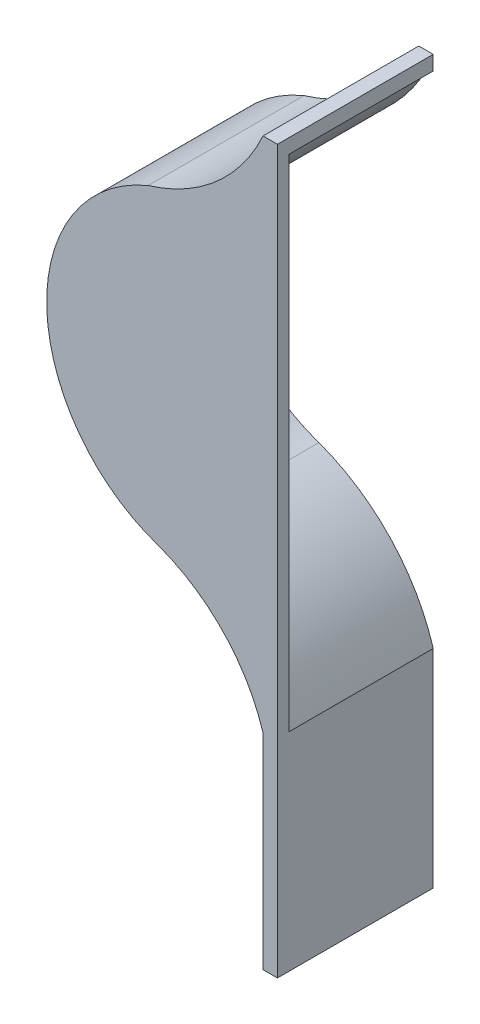
ISO-10303-21;
HEADER;
FILE_DESCRIPTION(('STEP AP214'),'2;1');
FILE_NAME('part.step','',(''),(''),'','','');
FILE_SCHEMA(('AUTOMOTIVE_DESIGN { 1 0 10303 214 1 1 1 1 }'));
ENDSEC;
DATA;
#1=APPLICATION_CONTEXT('core data for automotive mechanical design processes');
#2=APPLICATION_PROTOCOL_DEFINITION('international standard','automotive_design',2000,#1);
#3=PRODUCT_CONTEXT('',#1,'mechanical');
#4=PRODUCT('Part','Part','',(#3));
#5=PRODUCT_RELATED_PRODUCT_CATEGORY('part','',(#4));
#6=PRODUCT_DEFINITION_FORMATION('','',#4);
#7=PRODUCT_DEFINITION_CONTEXT('part definition',#1,'design');
#8=PRODUCT_DEFINITION('design','',#6,#7);
#9=PRODUCT_DEFINITION_SHAPE('','',#8);
#10=(LENGTH_UNIT() NAMED_UNIT(*) SI_UNIT(.MILLI.,.METRE.));
#11=(NAMED_UNIT(*) PLANE_ANGLE_UNIT() SI_UNIT($,.RADIAN.));
#12=(NAMED_UNIT(*) SI_UNIT($,.STERADIAN.) SOLID_ANGLE_UNIT());
#13=UNCERTAINTY_MEASURE_WITH_UNIT(LENGTH_MEASURE(1.E-05),#10,'distance_accuracy_value','');
#14=(GEOMETRIC_REPRESENTATION_CONTEXT(3) GLOBAL_UNCERTAINTY_ASSIGNED_CONTEXT((#13)) GLOBAL_UNIT_ASSIGNED_CONTEXT((#10,
#11,#12)) REPRESENTATION_CONTEXT('',''));
#15=CARTESIAN_POINT('',(0.,0.,0.));
#16=DIRECTION('',(0.,0.,1.));
#17=DIRECTION('',(1.,0.,0.));
#18=AXIS2_PLACEMENT_3D('',#15,#16,#17);
#19=CARTESIAN_POINT('',(2.54,2.54,-27.4));
#20=DIRECTION('',(1.,0.,0.));
#21=DIRECTION('',(0.,0.,-1.));
#22=AXIS2_PLACEMENT_3D('',#19,#20,#21);
#23=PLANE('',#22);
#24=DIRECTION('',(0.,0.,1.));
#25=VECTOR('',#24,1.);
#26=CARTESIAN_POINT('',(2.54,36.497172372089,-27.4));
#27=LINE('',#26,#25);
#28=CARTESIAN_POINT('',(2.54,36.497172372089,-27.4));
#29=VERTEX_POINT('',#28);
#30=CARTESIAN_POINT('',(2.53999999999999,36.497172372089,-2.));
#31=VERTEX_POINT('',#30);
#32=EDGE_CURVE('E126',#29,#31,#27,.T.);
#33=ORIENTED_EDGE('',*,*,#32,.T.);
#34=DIRECTION('',(0.,1.,0.));
#35=VECTOR('',#34,1.);
#36=CARTESIAN_POINT('',(2.54,0.,-2.));
#37=LINE('',#36,#35);
#38=CARTESIAN_POINT('',(2.54,124.46,-2.));
#39=VERTEX_POINT('',#38);
#40=EDGE_CURVE('E39',#31,#39,#37,.T.);
#41=ORIENTED_EDGE('',*,*,#40,.T.);
#42=DIRECTION('',(0.,0.,-1.));
#43=VECTOR('',#42,1.);
#44=CARTESIAN_POINT('',(2.54,124.46,-27.4));
#45=LINE('',#44,#43);
#46=CARTESIAN_POINT('',(2.54,124.46,-27.4));
#47=VERTEX_POINT('',#46);
#48=EDGE_CURVE('E11',#39,#47,#45,.T.);
#49=ORIENTED_EDGE('',*,*,#48,.T.);
#50=DIRECTION('',(0.,1.,0.));
#51=VECTOR('',#50,1.);
#52=CARTESIAN_POINT('',(2.54,27.1160766440633,-27.4));
#53=LINE('',#52,#51);
#54=CARTESIAN_POINT('',(2.54,127.,-27.4));
#55=VERTEX_POINT('',#54);
#56=EDGE_CURVE('E44',#47,#55,#53,.T.);
#57=ORIENTED_EDGE('',*,*,#56,.T.);
#58=DIRECTION('',(0.,0.,1.));
#59=VECTOR('',#58,1.);
#60=CARTESIAN_POINT('',(2.54,127.,-2.));
#61=LINE('',#60,#59);
#62=CARTESIAN_POINT('',(2.54,127.,0.));
#63=VERTEX_POINT('',#62);
#64=EDGE_CURVE('E211',#55,#63,#61,.T.);
#65=ORIENTED_EDGE('',*,*,#64,.T.);
#66=DIRECTION('',(0.,1.,0.));
#67=VECTOR('',#66,1.);
#68=CARTESIAN_POINT('',(2.54,0.,0.));
#69=LINE('',#68,#67);
#70=CARTESIAN_POINT('',(2.54,0.,0.));
#71=VERTEX_POINT('',#70);
#72=EDGE_CURVE('E212',#71,#63,#69,.T.);
#73=ORIENTED_EDGE('',*,*,#72,.F.);
#74=DIRECTION('',(0.,0.,-1.));
#75=VECTOR('',#74,1.);
#76=CARTESIAN_POINT('',(2.54,0.,-2.));
#77=LINE('',#76,#75);
#78=CARTESIAN_POINT('',(2.54,0.,-27.4));
#79=VERTEX_POINT('',#78);
#80=EDGE_CURVE('E128',#71,#79,#77,.T.);
#81=ORIENTED_EDGE('',*,*,#80,.T.);
#82=DIRECTION('',(0.,1.,0.));
#83=VECTOR('',#82,1.);
#84=CARTESIAN_POINT('',(2.54,2.54,-27.4));
#85=LINE('',#84,#83);
#86=EDGE_CURVE('E124',#79,#29,#85,.T.);
#87=ORIENTED_EDGE('',*,*,#86,.T.);
#88=EDGE_LOOP('',(#33,#41,#49,#57,#65,#73,#81,#87));
#89=FACE_BOUND('',#88,.T.);
#90=ADVANCED_FACE('F35',(#89),#23,.T.);
#91=CARTESIAN_POINT('',(0.,0.,-2.));
#92=DIRECTION('',(0.,0.,-1.));
#93=DIRECTION('',(-1.,0.,0.));
#94=AXIS2_PLACEMENT_3D('',#91,#92,#93);
#95=PLANE('',#94);
#96=ORIENTED_EDGE('',*,*,#40,.F.);
#97=CARTESIAN_POINT('',(-28.7497422785041,27.1160766440633,-2.));
#98=DIRECTION('',(0.,0.,1.));
#99=DIRECTION('',(-1.,0.,0.));
#100=AXIS2_PLACEMENT_3D('',#97,#98,#99);
#101=CIRCLE('',#100,32.6657761106879);
#102=CARTESIAN_POINT('',(-17.5632944580701,57.8067318028295,-2.));
#103=VERTEX_POINT('',#102);
#104=EDGE_CURVE('E139',#31,#103,#101,.T.);
#105=ORIENTED_EDGE('',*,*,#104,.T.);
#106=CARTESIAN_POINT('',(-9.24909817094705,82.7126385138728,-2.));
#107=DIRECTION('',(0.,0.,-1.));
#108=DIRECTION('',(-1.,0.,0.));
#109=AXIS2_PLACEMENT_3D('',#106,#107,#108);
#110=CIRCLE('',#109,26.2570000000001);
#111=CARTESIAN_POINT('',(-19.3378940008952,106.954054472963,-2.));
#112=VERTEX_POINT('',#111);
#113=EDGE_CURVE('E156',#103,#112,#110,.T.);
#114=ORIENTED_EDGE('',*,*,#113,.T.);
#115=CARTESIAN_POINT('',(-29.4490820276717,140.314540282513,-2.));
#116=DIRECTION('',(0.,0.,1.));
#117=DIRECTION('',(-1.,0.,0.));
#118=AXIS2_PLACEMENT_3D('',#115,#116,#117);
#119=CIRCLE('',#118,34.8591184163058);
#120=CARTESIAN_POINT('',(1.59591256392396,124.46,-2.));
#121=VERTEX_POINT('',#120);
#122=EDGE_CURVE('E158',#112,#121,#119,.T.);
#123=ORIENTED_EDGE('',*,*,#122,.T.);
#124=DIRECTION('',(1.,0.,0.));
#125=VECTOR('',#124,1.);
#126=CARTESIAN_POINT('',(1.59591256392396,124.46,-2.));
#127=LINE('',#126,#125);
#128=EDGE_CURVE('E133',#121,#39,#127,.T.);
#129=ORIENTED_EDGE('',*,*,#128,.T.);
#130=EDGE_LOOP('',(#96,#105,#114,#123,#129));
#131=FACE_BOUND('',#130,.T.);
#132=ADVANCED_FACE('F217',(#131),#95,.T.);
#133=CARTESIAN_POINT('',(0.,0.,-2.));
#134=DIRECTION('',(-1.,0.,0.));
#135=DIRECTION('',(0.,0.,1.));
#136=AXIS2_PLACEMENT_3D('',#133,#134,#135);
#137=PLANE('',#136);
#138=DIRECTION('',(0.,-1.,0.));
#139=VECTOR('',#138,1.);
#140=CARTESIAN_POINT('',(0.,0.,0.));
#141=LINE('',#140,#139);
#142=CARTESIAN_POINT('',(0.,36.116893562037,0.));
#143=VERTEX_POINT('',#142);
#144=CARTESIAN_POINT('',(0.,0.,0.));
#145=VERTEX_POINT('',#144);
#146=EDGE_CURVE('E191',#143,#145,#141,.T.);
#147=ORIENTED_EDGE('',*,*,#146,.F.);
#148=DIRECTION('',(0.,0.,-1.));
#149=VECTOR('',#148,1.);
#150=CARTESIAN_POINT('',(0.,36.116893562037,98.5253501483119));
#151=LINE('',#150,#149);
#152=CARTESIAN_POINT('',(0.,36.116893562037,-27.4));
#153=VERTEX_POINT('',#152);
#154=EDGE_CURVE('E183',#143,#153,#151,.T.);
#155=ORIENTED_EDGE('',*,*,#154,.T.);
#156=DIRECTION('',(0.,1.,0.));
#157=VECTOR('',#156,1.);
#158=CARTESIAN_POINT('',(0.,0.,-27.4));
#159=LINE('',#158,#157);
#160=CARTESIAN_POINT('',(0.,0.,-27.4));
#161=VERTEX_POINT('',#160);
#162=EDGE_CURVE('E168',#161,#153,#159,.T.);
#163=ORIENTED_EDGE('',*,*,#162,.F.);
#164=DIRECTION('',(0.,0.,1.));
#165=VECTOR('',#164,1.);
#166=CARTESIAN_POINT('',(0.,0.,-2.));
#167=LINE('',#166,#165);
#168=EDGE_CURVE('E230',#161,#145,#167,.T.);
#169=ORIENTED_EDGE('',*,*,#168,.T.);
#170=EDGE_LOOP('',(#147,#155,#163,#169));
#171=FACE_BOUND('',#170,.T.);
#172=ADVANCED_FACE('F37',(#171),#137,.T.);
#173=CARTESIAN_POINT('',(0.,127.,-2.));
#174=DIRECTION('',(0.,1.,0.));
#175=DIRECTION('',(0.,0.,1.));
#176=AXIS2_PLACEMENT_3D('',#173,#174,#175);
#177=PLANE('',#176);
#178=ORIENTED_EDGE('',*,*,#64,.F.);
#179=DIRECTION('',(1.,0.,0.));
#180=VECTOR('',#179,1.);
#181=CARTESIAN_POINT('',(0.,127.,-27.4));
#182=LINE('',#181,#180);
#183=CARTESIAN_POINT('',(0.,127.,-27.4));
#184=VERTEX_POINT('',#183);
#185=EDGE_CURVE('E180',#184,#55,#182,.T.);
#186=ORIENTED_EDGE('',*,*,#185,.F.);
#187=DIRECTION('',(0.,0.,1.));
#188=VECTOR('',#187,1.);
#189=CARTESIAN_POINT('',(0.,127.,-2.));
#190=LINE('',#189,#188);
#191=CARTESIAN_POINT('',(0.,127.,0.));
#192=VERTEX_POINT('',#191);
#193=EDGE_CURVE('E214',#184,#192,#190,.T.);
#194=ORIENTED_EDGE('',*,*,#193,.T.);
#195=DIRECTION('',(-1.,0.,0.));
#196=VECTOR('',#195,1.);
#197=CARTESIAN_POINT('',(0.,127.,0.));
#198=LINE('',#197,#196);
#199=EDGE_CURVE('E228',#63,#192,#198,.T.);
#200=ORIENTED_EDGE('',*,*,#199,.F.);
#201=EDGE_LOOP('',(#178,#186,#194,#200));
#202=FACE_BOUND('',#201,.T.);
#203=ADVANCED_FACE('F227',(#202),#177,.T.);
#204=CARTESIAN_POINT('',(0.,0.,-2.));
#205=DIRECTION('',(0.,-1.,0.));
#206=DIRECTION('',(0.,0.,-1.));
#207=AXIS2_PLACEMENT_3D('',#204,#205,#206);
#208=PLANE('',#207);
#209=ORIENTED_EDGE('',*,*,#80,.F.);
#210=DIRECTION('',(1.,0.,0.));
#211=VECTOR('',#210,1.);
#212=CARTESIAN_POINT('',(0.,0.,0.));
#213=LINE('',#212,#211);
#214=EDGE_CURVE('E231',#145,#71,#213,.T.);
#215=ORIENTED_EDGE('',*,*,#214,.F.);
#216=ORIENTED_EDGE('',*,*,#168,.F.);
#217=DIRECTION('',(-1.,0.,0.));
#218=VECTOR('',#217,1.);
#219=CARTESIAN_POINT('',(127.,0.,-27.4));
#220=LINE('',#219,#218);
#221=EDGE_CURVE('E140',#79,#161,#220,.T.);
#222=ORIENTED_EDGE('',*,*,#221,.F.);
#223=EDGE_LOOP('',(#209,#215,#216,#222));
#224=FACE_BOUND('',#223,.T.);
#225=ADVANCED_FACE('F244',(#224),#208,.T.);
#226=CARTESIAN_POINT('',(0.,0.,0.));
#227=DIRECTION('',(0.,0.,-1.));
#228=DIRECTION('',(-1.,0.,0.));
#229=AXIS2_PLACEMENT_3D('',#226,#227,#228);
#230=PLANE('',#229);
#231=ORIENTED_EDGE('',*,*,#214,.T.);
#232=ORIENTED_EDGE('',*,*,#72,.T.);
#233=ORIENTED_EDGE('',*,*,#199,.T.);
#234=CARTESIAN_POINT('',(-29.4490820276717,140.314540282513,0.));
#235=DIRECTION('',(0.,0.,-1.));
#236=DIRECTION('',(-1.,0.,0.));
#237=AXIS2_PLACEMENT_3D('',#234,#235,#236);
#238=CIRCLE('',#237,32.3191184163058);
#239=CARTESIAN_POINT('',(-20.19134681662,109.349725508818,0.));
#240=VERTEX_POINT('',#239);
#241=EDGE_CURVE('E187',#240,#192,#238,.F.);
#242=ORIENTED_EDGE('',*,*,#241,.F.);
#243=CARTESIAN_POINT('',(-9.24909817094705,82.7126385138728,0.));
#244=DIRECTION('',(0.,0.,-1.));
#245=DIRECTION('',(-1.,0.,0.));
#246=AXIS2_PLACEMENT_3D('',#243,#244,#245);
#247=CIRCLE('',#246,28.797);
#248=CARTESIAN_POINT('',(-18.40192423169,55.408921109428,0.));
#249=VERTEX_POINT('',#248);
#250=EDGE_CURVE('E184',#249,#240,#247,.T.);
#251=ORIENTED_EDGE('',*,*,#250,.F.);
#252=CARTESIAN_POINT('',(-28.7497422785041,27.1160766440633,0.));
#253=DIRECTION('',(0.,0.,-1.));
#254=DIRECTION('',(-1.,0.,0.));
#255=AXIS2_PLACEMENT_3D('',#252,#253,#254);
#256=CIRCLE('',#255,30.1257761106878);
#257=EDGE_CURVE('E188',#143,#249,#256,.F.);
#258=ORIENTED_EDGE('',*,*,#257,.F.);
#259=ORIENTED_EDGE('',*,*,#146,.T.);
#260=EDGE_LOOP('',(#231,#232,#233,#242,#251,#258,#259));
#261=FACE_BOUND('',#260,.T.);
#262=ADVANCED_FACE('F238',(#261),#230,.F.);
#263=CARTESIAN_POINT('',(-29.4490820276717,140.314540282513,98.5253501483119));
#264=DIRECTION('',(0.,0.,-1.));
#265=DIRECTION('',(-1.,0.,0.));
#266=AXIS2_PLACEMENT_3D('',#263,#264,#265);
#267=CYLINDRICAL_SURFACE('',#266,32.3191184163058);
#268=DIRECTION('',(0.,0.,-1.));
#269=VECTOR('',#268,1.);
#270=CARTESIAN_POINT('',(-20.19134681662,109.349725508818,98.5253501483119));
#271=LINE('',#270,#269);
#272=CARTESIAN_POINT('',(-20.19134681662,109.349725508818,-27.4));
#273=VERTEX_POINT('',#272);
#274=EDGE_CURVE('E192',#240,#273,#271,.T.);
#275=ORIENTED_EDGE('',*,*,#274,.F.);
#276=ORIENTED_EDGE('',*,*,#241,.T.);
#277=ORIENTED_EDGE('',*,*,#193,.F.);
#278=CARTESIAN_POINT('',(-29.4490820276717,140.314540282513,-27.4));
#279=DIRECTION('',(0.,0.,1.));
#280=DIRECTION('',(-1.,0.,0.));
#281=AXIS2_PLACEMENT_3D('',#278,#279,#280);
#282=CIRCLE('',#281,32.3191184163058);
#283=EDGE_CURVE('E177',#273,#184,#282,.T.);
#284=ORIENTED_EDGE('',*,*,#283,.F.);
#285=EDGE_LOOP('',(#275,#276,#277,#284));
#286=FACE_BOUND('',#285,.T.);
#287=ADVANCED_FACE('F254',(#286),#267,.F.);
#288=CARTESIAN_POINT('',(-9.24909817094705,82.7126385138728,98.5253501483119));
#289=DIRECTION('',(0.,0.,-1.));
#290=DIRECTION('',(-1.,0.,0.));
#291=AXIS2_PLACEMENT_3D('',#288,#289,#290);
#292=CYLINDRICAL_SURFACE('',#291,28.797);
#293=DIRECTION('',(0.,0.,-1.));
#294=VECTOR('',#293,1.);
#295=CARTESIAN_POINT('',(-18.40192423169,55.408921109428,98.5253501483119));
#296=LINE('',#295,#294);
#297=CARTESIAN_POINT('',(-18.40192423169,55.408921109428,-27.4));
#298=VERTEX_POINT('',#297);
#299=EDGE_CURVE('E194',#249,#298,#296,.T.);
#300=ORIENTED_EDGE('',*,*,#299,.F.);
#301=ORIENTED_EDGE('',*,*,#250,.T.);
#302=ORIENTED_EDGE('',*,*,#274,.T.);
#303=CARTESIAN_POINT('',(-9.24909817094705,82.7126385138728,-27.4));
#304=DIRECTION('',(0.,0.,-1.));
#305=DIRECTION('',(-1.,0.,0.));
#306=AXIS2_PLACEMENT_3D('',#303,#304,#305);
#307=CIRCLE('',#306,28.797);
#308=EDGE_CURVE('E174',#298,#273,#307,.T.);
#309=ORIENTED_EDGE('',*,*,#308,.F.);
#310=EDGE_LOOP('',(#300,#301,#302,#309));
#311=FACE_BOUND('',#310,.T.);
#312=ADVANCED_FACE('F251',(#311),#292,.T.);
#313=CARTESIAN_POINT('',(-28.7497422785041,27.1160766440633,98.5253501483119));
#314=DIRECTION('',(0.,0.,-1.));
#315=DIRECTION('',(-1.,0.,0.));
#316=AXIS2_PLACEMENT_3D('',#313,#314,#315);
#317=CYLINDRICAL_SURFACE('',#316,30.1257761106878);
#318=ORIENTED_EDGE('',*,*,#154,.F.);
#319=ORIENTED_EDGE('',*,*,#257,.T.);
#320=ORIENTED_EDGE('',*,*,#299,.T.);
#321=CARTESIAN_POINT('',(-28.7497422785041,27.1160766440633,-27.4));
#322=DIRECTION('',(0.,0.,1.));
#323=DIRECTION('',(-1.,0.,0.));
#324=AXIS2_PLACEMENT_3D('',#321,#322,#323);
#325=CIRCLE('',#324,30.1257761106878);
#326=EDGE_CURVE('E171',#153,#298,#325,.T.);
#327=ORIENTED_EDGE('',*,*,#326,.F.);
#328=EDGE_LOOP('',(#318,#319,#320,#327));
#329=FACE_BOUND('',#328,.T.);
#330=ADVANCED_FACE('F248',(#329),#317,.F.);
#331=CARTESIAN_POINT('',(-28.7497422785041,27.1160766440633,-27.4));
#332=DIRECTION('',(0.,0.,-1.));
#333=DIRECTION('',(-1.,0.,0.));
#334=AXIS2_PLACEMENT_3D('',#331,#332,#333);
#335=PLANE('',#334);
#336=ORIENTED_EDGE('',*,*,#86,.F.);
#337=ORIENTED_EDGE('',*,*,#221,.T.);
#338=ORIENTED_EDGE('',*,*,#162,.T.);
#339=ORIENTED_EDGE('',*,*,#326,.T.);
#340=ORIENTED_EDGE('',*,*,#308,.T.);
#341=ORIENTED_EDGE('',*,*,#283,.T.);
#342=ORIENTED_EDGE('',*,*,#185,.T.);
#343=ORIENTED_EDGE('',*,*,#56,.F.);
#344=DIRECTION('',(1.,0.,0.));
#345=VECTOR('',#344,1.);
#346=CARTESIAN_POINT('',(1.59591256392396,124.46,-27.4));
#347=LINE('',#346,#345);
#348=CARTESIAN_POINT('',(1.59591256392396,124.46,-27.4));
#349=VERTEX_POINT('',#348);
#350=EDGE_CURVE('E152',#349,#47,#347,.T.);
#351=ORIENTED_EDGE('',*,*,#350,.F.);
#352=CARTESIAN_POINT('',(-29.4490820276717,140.314540282513,-27.4));
#353=DIRECTION('',(0.,0.,1.));
#354=DIRECTION('',(-1.,0.,0.));
#355=AXIS2_PLACEMENT_3D('',#352,#353,#354);
#356=CIRCLE('',#355,34.8591184163058);
#357=CARTESIAN_POINT('',(-19.3378940008953,106.954054472963,-27.4));
#358=VERTEX_POINT('',#357);
#359=EDGE_CURVE('E148',#358,#349,#356,.T.);
#360=ORIENTED_EDGE('',*,*,#359,.F.);
#361=CARTESIAN_POINT('',(-9.24909817094705,82.7126385138728,-27.4));
#362=DIRECTION('',(0.,0.,-1.));
#363=DIRECTION('',(-1.,0.,0.));
#364=AXIS2_PLACEMENT_3D('',#361,#362,#363);
#365=CIRCLE('',#364,26.2570000000001);
#366=CARTESIAN_POINT('',(-17.5632944580702,57.8067318028295,-27.4));
#367=VERTEX_POINT('',#366);
#368=EDGE_CURVE('E146',#367,#358,#365,.T.);
#369=ORIENTED_EDGE('',*,*,#368,.F.);
#370=CARTESIAN_POINT('',(-28.7497422785041,27.1160766440633,-27.4));
#371=DIRECTION('',(0.,0.,1.));
#372=DIRECTION('',(-1.,0.,0.));
#373=AXIS2_PLACEMENT_3D('',#370,#371,#372);
#374=CIRCLE('',#373,32.6657761106879);
#375=EDGE_CURVE('E132',#29,#367,#374,.T.);
#376=ORIENTED_EDGE('',*,*,#375,.F.);
#377=EDGE_LOOP('',(#336,#337,#338,#339,#340,#341,#342,#343,#351,#360,#369,#376));
#378=FACE_BOUND('',#377,.T.);
#379=ADVANCED_FACE('F144',(#378),#335,.T.);
#380=CARTESIAN_POINT('',(-28.7497422785041,27.1160766440633,-27.4));
#381=DIRECTION('',(0.,0.,1.));
#382=DIRECTION('',(1.,0.,0.));
#383=AXIS2_PLACEMENT_3D('',#380,#381,#382);
#384=CYLINDRICAL_SURFACE('',#383,32.6657761106879);
#385=ORIENTED_EDGE('',*,*,#104,.F.);
#386=ORIENTED_EDGE('',*,*,#32,.F.);
#387=ORIENTED_EDGE('',*,*,#375,.T.);
#388=DIRECTION('',(0.,0.,1.));
#389=VECTOR('',#388,1.);
#390=CARTESIAN_POINT('',(-17.5632944580702,57.8067318028295,-27.4));
#391=LINE('',#390,#389);
#392=EDGE_CURVE('E141',#367,#103,#391,.T.);
#393=ORIENTED_EDGE('',*,*,#392,.T.);
#394=EDGE_LOOP('',(#385,#386,#387,#393));
#395=FACE_BOUND('',#394,.T.);
#396=ADVANCED_FACE('F136',(#395),#384,.T.);
#397=CARTESIAN_POINT('',(-9.24909817094705,82.7126385138728,-27.4));
#398=DIRECTION('',(0.,0.,1.));
#399=DIRECTION('',(1.,0.,0.));
#400=AXIS2_PLACEMENT_3D('',#397,#398,#399);
#401=CYLINDRICAL_SURFACE('',#400,26.2570000000001);
#402=ORIENTED_EDGE('',*,*,#113,.F.);
#403=ORIENTED_EDGE('',*,*,#392,.F.);
#404=ORIENTED_EDGE('',*,*,#368,.T.);
#405=DIRECTION('',(0.,0.,1.));
#406=VECTOR('',#405,1.);
#407=CARTESIAN_POINT('',(-19.3378940008953,106.954054472963,-27.4));
#408=LINE('',#407,#406);
#409=EDGE_CURVE('E163',#358,#112,#408,.T.);
#410=ORIENTED_EDGE('',*,*,#409,.T.);
#411=EDGE_LOOP('',(#402,#403,#404,#410));
#412=FACE_BOUND('',#411,.T.);
#413=ADVANCED_FACE('F274',(#412),#401,.F.);
#414=CARTESIAN_POINT('',(-29.4490820276717,140.314540282513,-27.4));
#415=DIRECTION('',(0.,0.,1.));
#416=DIRECTION('',(1.,0.,0.));
#417=AXIS2_PLACEMENT_3D('',#414,#415,#416);
#418=CYLINDRICAL_SURFACE('',#417,34.8591184163058);
#419=ORIENTED_EDGE('',*,*,#122,.F.);
#420=ORIENTED_EDGE('',*,*,#409,.F.);
#421=ORIENTED_EDGE('',*,*,#359,.T.);
#422=DIRECTION('',(0.,0.,1.));
#423=VECTOR('',#422,1.);
#424=CARTESIAN_POINT('',(1.59591256392396,124.46,-27.4));
#425=LINE('',#424,#423);
#426=EDGE_CURVE('E154',#349,#121,#425,.T.);
#427=ORIENTED_EDGE('',*,*,#426,.T.);
#428=EDGE_LOOP('',(#419,#420,#421,#427));
#429=FACE_BOUND('',#428,.T.);
#430=ADVANCED_FACE('F268',(#429),#418,.T.);
#431=CARTESIAN_POINT('',(1.59591256392396,124.46,-27.4));
#432=DIRECTION('',(0.,-1.,0.));
#433=DIRECTION('',(0.,0.,-1.));
#434=AXIS2_PLACEMENT_3D('',#431,#432,#433);
#435=PLANE('',#434);
#436=ORIENTED_EDGE('',*,*,#48,.F.);
#437=ORIENTED_EDGE('',*,*,#128,.F.);
#438=ORIENTED_EDGE('',*,*,#426,.F.);
#439=ORIENTED_EDGE('',*,*,#350,.T.);
#440=EDGE_LOOP('',(#436,#437,#438,#439));
#441=FACE_BOUND('',#440,.T.);
#442=ADVANCED_FACE('F220',(#441),#435,.T.);
#443=CLOSED_SHELL('',(#90,#132,#172,#203,#225,#262,#287,#312,#330,#379,#396,#413,#430,#442));
#444=MANIFOLD_SOLID_BREP('B2',#443);
#445=ADVANCED_BREP_SHAPE_REPRESENTATION('',(#18,#444),#14);
#446=SHAPE_DEFINITION_REPRESENTATION(#9,#445);
ENDSEC;
END-ISO-10303-21;
